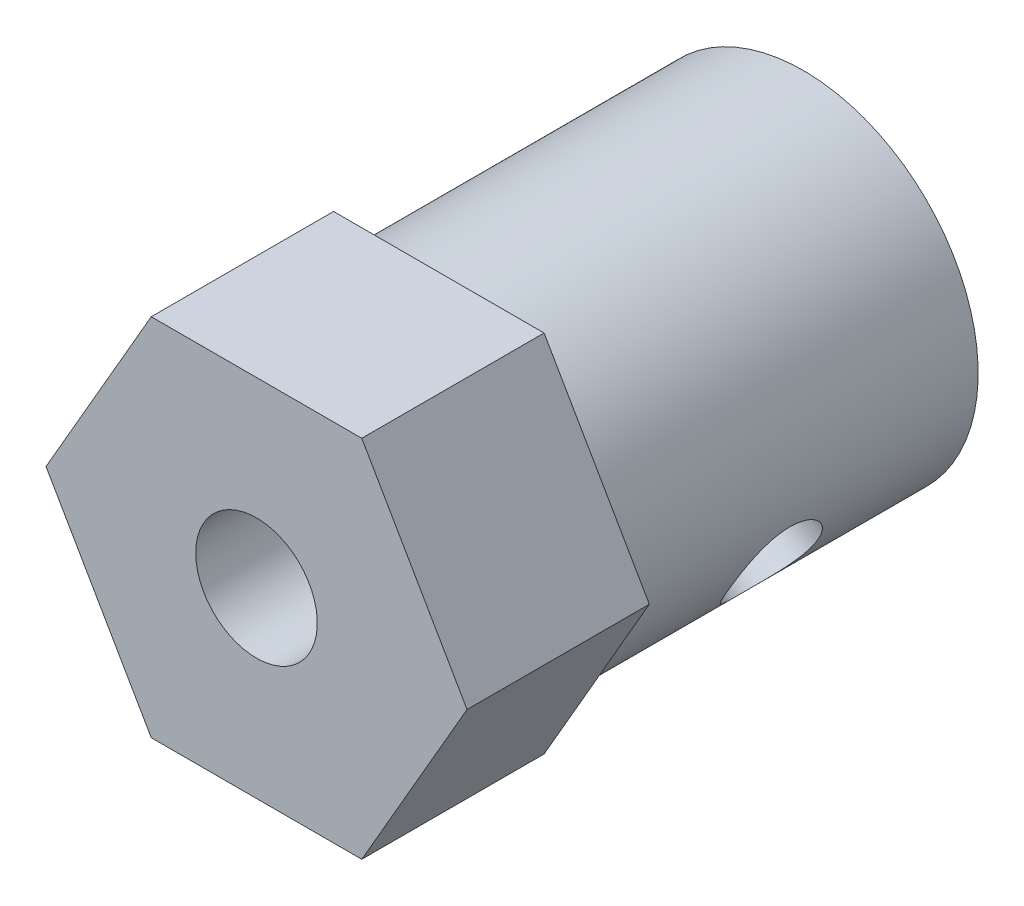
ISO-10303-21;
HEADER;
FILE_DESCRIPTION(('STEP AP214'),'2;1');
FILE_NAME('part.step','',(''),(''),'','','');
FILE_SCHEMA(('AUTOMOTIVE_DESIGN { 1 0 10303 214 1 1 1 1 }'));
ENDSEC;
DATA;
#1=APPLICATION_CONTEXT('core data for automotive mechanical design processes');
#2=APPLICATION_PROTOCOL_DEFINITION('international standard','automotive_design',2000,#1);
#3=PRODUCT_CONTEXT('',#1,'mechanical');
#4=PRODUCT('Part','Part','',(#3));
#5=PRODUCT_RELATED_PRODUCT_CATEGORY('part','',(#4));
#6=PRODUCT_DEFINITION_FORMATION('','',#4);
#7=PRODUCT_DEFINITION_CONTEXT('part definition',#1,'design');
#8=PRODUCT_DEFINITION('design','',#6,#7);
#9=PRODUCT_DEFINITION_SHAPE('','',#8);
#10=(LENGTH_UNIT() NAMED_UNIT(*) SI_UNIT(.MILLI.,.METRE.));
#11=(NAMED_UNIT(*) PLANE_ANGLE_UNIT() SI_UNIT($,.RADIAN.));
#12=(NAMED_UNIT(*) SI_UNIT($,.STERADIAN.) SOLID_ANGLE_UNIT());
#13=UNCERTAINTY_MEASURE_WITH_UNIT(LENGTH_MEASURE(1.E-05),#10,'distance_accuracy_value','');
#14=(GEOMETRIC_REPRESENTATION_CONTEXT(3) GLOBAL_UNCERTAINTY_ASSIGNED_CONTEXT((#13)) GLOBAL_UNIT_ASSIGNED_CONTEXT((#10,
#11,#12)) REPRESENTATION_CONTEXT('',''));
#15=CARTESIAN_POINT('',(0.,0.,0.));
#16=DIRECTION('',(0.,0.,1.));
#17=DIRECTION('',(1.,0.,0.));
#18=AXIS2_PLACEMENT_3D('',#15,#16,#17);
#19=CARTESIAN_POINT('',(-3.46410161513783,5.99999999999996,6.));
#20=DIRECTION('',(0.866025403784441,-0.499999999999995,0.));
#21=DIRECTION('',(0.499999999999995,0.866025403784442,0.));
#22=AXIS2_PLACEMENT_3D('',#19,#20,#21);
#23=PLANE('',#22);
#24=DIRECTION('',(-0.499999999999995,-0.866025403784441,0.));
#25=VECTOR('',#24,1.);
#26=CARTESIAN_POINT('',(-3.46410161513783,5.99999999999996,0.));
#27=LINE('',#26,#25);
#28=CARTESIAN_POINT('',(-3.46410161513783,5.99999999999996,0.));
#29=VERTEX_POINT('',#28);
#30=CARTESIAN_POINT('',(-6.92820323027551,0.,0.));
#31=VERTEX_POINT('',#30);
#32=EDGE_CURVE('E130',#29,#31,#27,.T.);
#33=ORIENTED_EDGE('',*,*,#32,.T.);
#34=DIRECTION('',(0.,0.,-1.));
#35=VECTOR('',#34,1.);
#36=CARTESIAN_POINT('',(-6.92820323027551,0.,6.));
#37=LINE('',#36,#35);
#38=CARTESIAN_POINT('',(-6.92820323027551,0.,6.));
#39=VERTEX_POINT('',#38);
#40=EDGE_CURVE('E52',#39,#31,#37,.T.);
#41=ORIENTED_EDGE('',*,*,#40,.F.);
#42=DIRECTION('',(-0.499999999999995,-0.866025403784441,0.));
#43=VECTOR('',#42,1.);
#44=CARTESIAN_POINT('',(-3.46410161513783,5.99999999999996,6.));
#45=LINE('',#44,#43);
#46=CARTESIAN_POINT('',(-3.46410161513783,5.99999999999996,6.));
#47=VERTEX_POINT('',#46);
#48=EDGE_CURVE('E141',#47,#39,#45,.T.);
#49=ORIENTED_EDGE('',*,*,#48,.F.);
#50=DIRECTION('',(0.,0.,-1.));
#51=VECTOR('',#50,1.);
#52=CARTESIAN_POINT('',(-3.46410161513783,5.99999999999996,6.));
#53=LINE('',#52,#51);
#54=EDGE_CURVE('E126',#47,#29,#53,.T.);
#55=ORIENTED_EDGE('',*,*,#54,.T.);
#56=EDGE_LOOP('',(#33,#41,#49,#55));
#57=FACE_BOUND('',#56,.T.);
#58=ADVANCED_FACE('F38',(#57),#23,.F.);
#59=CARTESIAN_POINT('',(-6.92820323027551,0.,6.));
#60=DIRECTION('',(0.866025403784438,0.500000000000001,0.));
#61=DIRECTION('',(-0.500000000000001,0.866025403784438,0.));
#62=AXIS2_PLACEMENT_3D('',#59,#60,#61);
#63=PLANE('',#62);
#64=DIRECTION('',(0.500000000000001,-0.866025403784438,0.));
#65=VECTOR('',#64,1.);
#66=CARTESIAN_POINT('',(-6.92820323027551,0.,0.));
#67=LINE('',#66,#65);
#68=CARTESIAN_POINT('',(-3.46410161513774,-6.00000000000001,0.));
#69=VERTEX_POINT('',#68);
#70=EDGE_CURVE('E133',#31,#69,#67,.T.);
#71=ORIENTED_EDGE('',*,*,#70,.T.);
#72=DIRECTION('',(0.,0.,-1.));
#73=VECTOR('',#72,1.);
#74=CARTESIAN_POINT('',(-3.46410161513774,-6.00000000000001,6.));
#75=LINE('',#74,#73);
#76=CARTESIAN_POINT('',(-3.46410161513774,-6.00000000000001,6.));
#77=VERTEX_POINT('',#76);
#78=EDGE_CURVE('E145',#77,#69,#75,.T.);
#79=ORIENTED_EDGE('',*,*,#78,.F.);
#80=DIRECTION('',(0.500000000000001,-0.866025403784438,0.));
#81=VECTOR('',#80,1.);
#82=CARTESIAN_POINT('',(-6.92820323027551,0.,6.));
#83=LINE('',#82,#81);
#84=EDGE_CURVE('E99',#39,#77,#83,.T.);
#85=ORIENTED_EDGE('',*,*,#84,.F.);
#86=ORIENTED_EDGE('',*,*,#40,.T.);
#87=EDGE_LOOP('',(#71,#79,#85,#86));
#88=FACE_BOUND('',#87,.T.);
#89=ADVANCED_FACE('F148',(#88),#63,.F.);
#90=CARTESIAN_POINT('',(-3.46410161513774,-6.00000000000001,6.));
#91=DIRECTION('',(0.,1.,0.));
#92=DIRECTION('',(-1.,0.,0.));
#93=AXIS2_PLACEMENT_3D('',#90,#91,#92);
#94=PLANE('',#93);
#95=DIRECTION('',(1.,0.,0.));
#96=VECTOR('',#95,1.);
#97=CARTESIAN_POINT('',(-3.46410161513774,-6.00000000000001,0.));
#98=LINE('',#97,#96);
#99=CARTESIAN_POINT('',(3.46410161513778,-5.99999999999999,0.));
#100=VERTEX_POINT('',#99);
#101=EDGE_CURVE('E136',#69,#100,#98,.T.);
#102=ORIENTED_EDGE('',*,*,#101,.T.);
#103=DIRECTION('',(0.,0.,-1.));
#104=VECTOR('',#103,1.);
#105=CARTESIAN_POINT('',(3.46410161513778,-5.99999999999999,6.));
#106=LINE('',#105,#104);
#107=CARTESIAN_POINT('',(3.46410161513778,-5.99999999999999,6.));
#108=VERTEX_POINT('',#107);
#109=EDGE_CURVE('E121',#108,#100,#106,.T.);
#110=ORIENTED_EDGE('',*,*,#109,.F.);
#111=DIRECTION('',(1.,0.,0.));
#112=VECTOR('',#111,1.);
#113=CARTESIAN_POINT('',(-3.46410161513774,-6.00000000000001,6.));
#114=LINE('',#113,#112);
#115=EDGE_CURVE('E112',#77,#108,#114,.T.);
#116=ORIENTED_EDGE('',*,*,#115,.F.);
#117=ORIENTED_EDGE('',*,*,#78,.T.);
#118=EDGE_LOOP('',(#102,#110,#116,#117));
#119=FACE_BOUND('',#118,.T.);
#120=ADVANCED_FACE('F156',(#119),#94,.F.);
#121=CARTESIAN_POINT('',(3.46410161513778,-5.99999999999999,6.));
#122=DIRECTION('',(-0.866025403784442,0.499999999999995,0.));
#123=DIRECTION('',(-0.499999999999995,-0.866025403784442,0.));
#124=AXIS2_PLACEMENT_3D('',#121,#122,#123);
#125=PLANE('',#124);
#126=DIRECTION('',(0.499999999999995,0.866025403784441,0.));
#127=VECTOR('',#126,1.);
#128=CARTESIAN_POINT('',(3.46410161513778,-5.99999999999999,0.));
#129=LINE('',#128,#127);
#130=CARTESIAN_POINT('',(6.92820323027551,0.,0.));
#131=VERTEX_POINT('',#130);
#132=EDGE_CURVE('E120',#100,#131,#129,.T.);
#133=ORIENTED_EDGE('',*,*,#132,.T.);
#134=DIRECTION('',(0.,0.,-1.));
#135=VECTOR('',#134,1.);
#136=CARTESIAN_POINT('',(6.92820323027551,0.,6.));
#137=LINE('',#136,#135);
#138=CARTESIAN_POINT('',(6.92820323027551,0.,6.));
#139=VERTEX_POINT('',#138);
#140=EDGE_CURVE('E117',#139,#131,#137,.T.);
#141=ORIENTED_EDGE('',*,*,#140,.F.);
#142=DIRECTION('',(0.499999999999995,0.866025403784441,0.));
#143=VECTOR('',#142,1.);
#144=CARTESIAN_POINT('',(3.46410161513778,-5.99999999999999,6.));
#145=LINE('',#144,#143);
#146=EDGE_CURVE('E106',#108,#139,#145,.T.);
#147=ORIENTED_EDGE('',*,*,#146,.F.);
#148=ORIENTED_EDGE('',*,*,#109,.T.);
#149=EDGE_LOOP('',(#133,#141,#147,#148));
#150=FACE_BOUND('',#149,.T.);
#151=ADVANCED_FACE('F118',(#150),#125,.F.);
#152=CARTESIAN_POINT('',(6.92820323027551,0.,6.));
#153=DIRECTION('',(-0.866025403784434,-0.500000000000007,0.));
#154=DIRECTION('',(0.500000000000007,-0.866025403784435,0.));
#155=AXIS2_PLACEMENT_3D('',#152,#153,#154);
#156=PLANE('',#155);
#157=DIRECTION('',(-0.500000000000007,0.866025403784434,0.));
#158=VECTOR('',#157,1.);
#159=CARTESIAN_POINT('',(6.92820323027551,0.,0.));
#160=LINE('',#159,#158);
#161=CARTESIAN_POINT('',(3.4641016151377,6.00000000000003,0.));
#162=VERTEX_POINT('',#161);
#163=EDGE_CURVE('E84',#131,#162,#160,.T.);
#164=ORIENTED_EDGE('',*,*,#163,.T.);
#165=DIRECTION('',(0.,0.,-1.));
#166=VECTOR('',#165,1.);
#167=CARTESIAN_POINT('',(3.4641016151377,6.00000000000003,6.));
#168=LINE('',#167,#166);
#169=CARTESIAN_POINT('',(3.4641016151377,6.00000000000003,6.));
#170=VERTEX_POINT('',#169);
#171=EDGE_CURVE('E122',#170,#162,#168,.T.);
#172=ORIENTED_EDGE('',*,*,#171,.F.);
#173=DIRECTION('',(-0.500000000000007,0.866025403784434,0.));
#174=VECTOR('',#173,1.);
#175=CARTESIAN_POINT('',(6.92820323027551,0.,6.));
#176=LINE('',#175,#174);
#177=EDGE_CURVE('E110',#139,#170,#176,.T.);
#178=ORIENTED_EDGE('',*,*,#177,.F.);
#179=ORIENTED_EDGE('',*,*,#140,.T.);
#180=EDGE_LOOP('',(#164,#172,#178,#179));
#181=FACE_BOUND('',#180,.T.);
#182=ADVANCED_FACE('F124',(#181),#156,.F.);
#183=CARTESIAN_POINT('',(3.4641016151377,6.00000000000003,6.));
#184=DIRECTION('',(0.,-1.,0.));
#185=DIRECTION('',(1.,0.,0.));
#186=AXIS2_PLACEMENT_3D('',#183,#184,#185);
#187=PLANE('',#186);
#188=DIRECTION('',(-1.,0.,0.));
#189=VECTOR('',#188,1.);
#190=CARTESIAN_POINT('',(3.4641016151377,6.00000000000003,0.));
#191=LINE('',#190,#189);
#192=EDGE_CURVE('E90',#162,#29,#191,.T.);
#193=ORIENTED_EDGE('',*,*,#192,.T.);
#194=ORIENTED_EDGE('',*,*,#54,.F.);
#195=DIRECTION('',(-1.,0.,0.));
#196=VECTOR('',#195,1.);
#197=CARTESIAN_POINT('',(3.4641016151377,6.00000000000003,6.));
#198=LINE('',#197,#196);
#199=EDGE_CURVE('E61',#170,#47,#198,.T.);
#200=ORIENTED_EDGE('',*,*,#199,.F.);
#201=ORIENTED_EDGE('',*,*,#171,.T.);
#202=EDGE_LOOP('',(#193,#194,#200,#201));
#203=FACE_BOUND('',#202,.T.);
#204=ADVANCED_FACE('F210',(#203),#187,.F.);
#205=CARTESIAN_POINT('',(0.,0.,6.));
#206=DIRECTION('',(0.,0.,1.));
#207=DIRECTION('',(1.,0.,0.));
#208=AXIS2_PLACEMENT_3D('',#205,#206,#207);
#209=PLANE('',#208);
#210=CARTESIAN_POINT('',(0.,0.,6.));
#211=DIRECTION('',(0.,0.,-1.));
#212=DIRECTION('',(-1.,0.,0.));
#213=AXIS2_PLACEMENT_3D('',#210,#211,#212);
#214=CIRCLE('',#213,2.);
#215=CARTESIAN_POINT('',(-2.,0.,6.));
#216=VERTEX_POINT('',#215);
#217=EDGE_CURVE('E162',#216,#216,#214,.T.);
#218=ORIENTED_EDGE('',*,*,#217,.T.);
#219=EDGE_LOOP('',(#218));
#220=FACE_BOUND('',#219,.T.);
#221=ORIENTED_EDGE('',*,*,#48,.T.);
#222=ORIENTED_EDGE('',*,*,#84,.T.);
#223=ORIENTED_EDGE('',*,*,#115,.T.);
#224=ORIENTED_EDGE('',*,*,#146,.T.);
#225=ORIENTED_EDGE('',*,*,#177,.T.);
#226=ORIENTED_EDGE('',*,*,#199,.T.);
#227=EDGE_LOOP('',(#221,#222,#223,#224,#225,#226));
#228=FACE_BOUND('',#227,.T.);
#229=ADVANCED_FACE('F108',(#220,#228),#209,.T.);
#230=CARTESIAN_POINT('',(0.,0.,0.));
#231=DIRECTION('',(0.,0.,1.));
#232=DIRECTION('',(1.,0.,0.));
#233=AXIS2_PLACEMENT_3D('',#230,#231,#232);
#234=PLANE('',#233);
#235=CARTESIAN_POINT('',(0.,0.,0.));
#236=DIRECTION('',(0.,0.,-1.));
#237=DIRECTION('',(-1.,0.,0.));
#238=AXIS2_PLACEMENT_3D('',#235,#236,#237);
#239=CIRCLE('',#238,5.75);
#240=CARTESIAN_POINT('',(-5.75,0.,0.));
#241=VERTEX_POINT('',#240);
#242=EDGE_CURVE('E11',#241,#241,#239,.T.);
#243=ORIENTED_EDGE('',*,*,#242,.F.);
#244=EDGE_LOOP('',(#243));
#245=FACE_BOUND('',#244,.T.);
#246=ORIENTED_EDGE('',*,*,#32,.F.);
#247=ORIENTED_EDGE('',*,*,#192,.F.);
#248=ORIENTED_EDGE('',*,*,#163,.F.);
#249=ORIENTED_EDGE('',*,*,#132,.F.);
#250=ORIENTED_EDGE('',*,*,#101,.F.);
#251=ORIENTED_EDGE('',*,*,#70,.F.);
#252=EDGE_LOOP('',(#246,#247,#248,#249,#250,#251));
#253=FACE_BOUND('',#252,.T.);
#254=ADVANCED_FACE('F153',(#245,#253),#234,.F.);
#255=CARTESIAN_POINT('',(0.,0.,-12.));
#256=DIRECTION('',(0.,0.,1.));
#257=DIRECTION('',(1.,0.,0.));
#258=AXIS2_PLACEMENT_3D('',#255,#256,#257);
#259=CYLINDRICAL_SURFACE('',#258,5.75);
#260=CARTESIAN_POINT('',(5.55722113075736,-1.47641230822012,-6.));
#261=CARTESIAN_POINT('',(5.55722136071016,-1.47641489598219,-6.08270251187962));
#262=CARTESIAN_POINT('',(5.55540776706454,-1.48329007948835,-6.16542787728107));
#263=CARTESIAN_POINT('',(5.54807553473378,-1.51047987820257,-6.32849428591396));
#264=CARTESIAN_POINT('',(5.54255493246361,-1.53080161590377,-6.40883404193632));
#265=CARTESIAN_POINT('',(5.52760134616089,-1.58394395701895,-6.56474682353535));
#266=CARTESIAN_POINT('',(5.51817370147193,-1.61674749787789,-6.64032619287306));
#267=CARTESIAN_POINT('',(5.49509515344553,-1.69352577324472,-6.78486591425887));
#268=CARTESIAN_POINT('',(5.48144397417512,-1.73750123760575,-6.85382583345769));
#269=CARTESIAN_POINT('',(5.44922524142547,-1.83607840051586,-6.98482034003843));
#270=CARTESIAN_POINT('',(5.43055778730774,-1.89088926191198,-7.04667299219177));
#271=CARTESIAN_POINT('',(5.38812936910052,-2.0085989367878,-7.16009082769641));
#272=CARTESIAN_POINT('',(5.36436789625488,-2.07149855786688,-7.21165498250828));
#273=CARTESIAN_POINT('',(5.31117832236998,-2.20433046836102,-7.30378569751234));
#274=CARTESIAN_POINT('',(5.28166917074583,-2.27435554396496,-7.34417214404675));
#275=CARTESIAN_POINT('',(5.21734054730939,-2.41827644085031,-7.41162763674079));
#276=CARTESIAN_POINT('',(5.18252193222295,-2.49217163639514,-7.43869882845441));
#277=CARTESIAN_POINT('',(5.10890534133279,-2.63974107934647,-7.47816869107317));
#278=CARTESIAN_POINT('',(5.07021160293842,-2.71338451067179,-7.49087666170707));
#279=CARTESIAN_POINT('',(4.98914035484316,-2.8597150031523,-7.50223166870554));
#280=CARTESIAN_POINT('',(4.94676343726796,-2.93240221587847,-7.5008809610801));
#281=CARTESIAN_POINT('',(4.86067756766856,-3.07293746674693,-7.48437641147546));
#282=CARTESIAN_POINT('',(4.81702548141221,-3.14085997104418,-7.46955662892109));
#283=CARTESIAN_POINT('',(4.72892558823583,-3.27200352174088,-7.42707332679328));
#284=CARTESIAN_POINT('',(4.68447773708927,-3.33522430581835,-7.3994090912151));
#285=CARTESIAN_POINT('',(4.59600500303769,-3.45614085391043,-7.33176111055377));
#286=CARTESIAN_POINT('',(4.55198830983483,-3.51377757775231,-7.29166134420953));
#287=CARTESIAN_POINT('',(4.46656720195115,-3.62174318001789,-7.20036926072058));
#288=CARTESIAN_POINT('',(4.42516327919811,-3.67207068458241,-7.14917486269623));
#289=CARTESIAN_POINT('',(4.34556760565659,-3.7659588427232,-7.03536714625521));
#290=CARTESIAN_POINT('',(4.30750615214473,-3.80927692660276,-6.97246225547536));
#291=CARTESIAN_POINT('',(4.23785578042895,-3.8866173972475,-6.83794521486358));
#292=CARTESIAN_POINT('',(4.20626722266665,-3.92063926639042,-6.7663325804967));
#293=CARTESIAN_POINT('',(4.1510923893375,-3.97901518520282,-6.61585635776758));
#294=CARTESIAN_POINT('',(4.12755259364876,-4.00331321465999,-6.53695388838251));
#295=CARTESIAN_POINT('',(4.090138880542,-4.04153276606443,-6.37448448296469));
#296=CARTESIAN_POINT('',(4.0762626840089,-4.05545673474001,-6.29091865178946));
#297=CARTESIAN_POINT('',(4.05931325975991,-4.07242147034947,-6.12406094525848));
#298=CARTESIAN_POINT('',(4.05594186189961,-4.07576266731435,-6.04082983858711));
#299=CARTESIAN_POINT('',(4.05937152111611,-4.07234685151389,-5.87479170466801));
#300=CARTESIAN_POINT('',(4.06617154812631,-4.06559086129712,-5.79198463532986));
#301=CARTESIAN_POINT('',(4.08929757745671,-4.04232648260581,-5.63070165598545));
#302=CARTESIAN_POINT('',(4.10544809988444,-4.02599767699227,-5.5521743674906));
#303=CARTESIAN_POINT('',(4.14620349249304,-3.98401143692444,-5.39995982905624));
#304=CARTESIAN_POINT('',(4.1708094311122,-3.95835282351865,-5.32627319219064));
#305=CARTESIAN_POINT('',(4.22777189799079,-3.89746235669492,-5.18411163032052));
#306=CARTESIAN_POINT('',(4.2602813513885,-3.86203949812469,-5.11577990334861));
#307=CARTESIAN_POINT('',(4.33113840027661,-3.78240336253314,-4.98781144742332));
#308=CARTESIAN_POINT('',(4.36948704402819,-3.73818850672095,-4.92817628346225));
#309=CARTESIAN_POINT('',(4.45138754174426,-3.64030552024393,-4.81760944837593));
#310=CARTESIAN_POINT('',(4.49505352262524,-3.58641077168379,-4.7669623765694));
#311=CARTESIAN_POINT('',(4.58474574264705,-3.47101406352671,-4.67788871513074));
#312=CARTESIAN_POINT('',(4.63077185645956,-3.40951250762377,-4.63946147737699));
#313=CARTESIAN_POINT('',(4.72289476696002,-3.28069833721807,-4.57626499124511));
#314=CARTESIAN_POINT('',(4.76898840829988,-3.21343308512531,-4.55139484814367));
#315=CARTESIAN_POINT('',(4.85978523879196,-3.07438991312508,-4.51572190582261));
#316=CARTESIAN_POINT('',(4.90448871991868,-3.00261295050912,-4.50491613292621));
#317=CARTESIAN_POINT('',(4.98966950541399,-2.85875540689107,-4.49785826561112));
#318=CARTESIAN_POINT('',(5.0302323975609,-2.78674573137666,-4.50118782399509));
#319=CARTESIAN_POINT('',(5.10746567709305,-2.64253393975375,-4.52133940731707));
#320=CARTESIAN_POINT('',(5.14413619951267,-2.57033183041033,-4.53816096401629));
#321=CARTESIAN_POINT('',(5.21263698300613,-2.42839294863188,-4.58458667775333));
#322=CARTESIAN_POINT('',(5.24449642665122,-2.35864345904262,-4.61410920811083));
#323=CARTESIAN_POINT('',(5.30331713657454,-2.22323705430391,-4.68502564003475));
#324=CARTESIAN_POINT('',(5.33027773862,-2.15758069493265,-4.72642114949646));
#325=CARTESIAN_POINT('',(5.37989987925112,-2.03074816512123,-4.8211511060026));
#326=CARTESIAN_POINT('',(5.40243300755437,-1.96973066277838,-4.87476524455818));
#327=CARTESIAN_POINT('',(5.44252151759536,-1.85609752882473,-4.99187563894747));
#328=CARTESIAN_POINT('',(5.46007560580036,-1.80348408209869,-5.05537445615319));
#329=CARTESIAN_POINT('',(5.49085193822908,-1.70752535479361,-5.19204025952238));
#330=CARTESIAN_POINT('',(5.50397654142989,-1.66439548816294,-5.26538079382189));
#331=CARTESIAN_POINT('',(5.525759730213,-1.59058804468881,-5.41866048784024));
#332=CARTESIAN_POINT('',(5.53442135588035,-1.55990199442577,-5.4985951126335));
#333=CARTESIAN_POINT('',(5.54647206684565,-1.51643034957237,-5.64857628641251));
#334=CARTESIAN_POINT('',(5.55051320500374,-1.50146914084626,-5.71794782542872));
#335=CARTESIAN_POINT('',(5.55588749873707,-1.48145952205819,-5.85820741497359));
#336=CARTESIAN_POINT('',(5.55722093360818,-1.47641008961192,-5.92909530833006));
#337=CARTESIAN_POINT('',(5.55722113075736,-1.47641230822012,-6.));
#338=B_SPLINE_CURVE_WITH_KNOTS('',3,(#260,#261,#262,#263,#264,#265,#266,#267,#268,#269,#270,
#271,#272,#273,#274,#275,#276,#277,#278,#279,#280,#281,#282,#283,#284,#285,#286,#287,#288,#289,
#290,#291,#292,#293,#294,#295,#296,#297,#298,#299,#300,#301,#302,#303,#304,#305,#306,#307,#308,
#309,#310,#311,#312,#313,#314,#315,#316,#317,#318,#319,#320,#321,#322,#323,#324,#325,#326,#327,
#328,#329,#330,#331,#332,#333,#334,#335,#336,#337),.UNSPECIFIED.,.T.,.F.,(4,2,2,2,2,2,2,2,2,2,2,
2,2,2,2,2,2,2,2,2,2,2,2,2,2,2,2,2,2,2,2,2,2,2,2,2,2,2,4),(0.,0.247846932213468,
0.495825251450721,0.743465796519596,0.991122523916576,1.24413298994995,1.49716873674027,
1.75407149955015,2.01093285275295,2.26215074877579,2.51332833223609,2.75844131790607,
3.00356796886319,3.25105414713942,3.49858678350027,3.75340001453818,4.00822743093465,
4.26450250455337,4.52071711639577,4.76958977198248,5.01843722578485,5.26275935549397,
5.50711236945145,5.75663370302619,6.00619988401493,6.26263234557327,6.51905120407021,
6.7735347403164,7.02796446151302,7.27491743805458,7.52186184448271,7.76724235555625,
8.01265611292845,8.26438206043911,8.51617334546956,8.77319910700255,9.03004955584013,
9.24256212496341,9.4550527725935),.UNSPECIFIED.);
#339=CARTESIAN_POINT('',(5.55722113075736,-1.47641230822012,-6.));
#340=VERTEX_POINT('',#339);
#341=EDGE_CURVE('E166',#340,#340,#338,.T.);
#342=ORIENTED_EDGE('',*,*,#341,.T.);
#343=EDGE_LOOP('',(#342));
#344=FACE_BOUND('',#343,.T.);
#345=CARTESIAN_POINT('',(0.,0.,-12.));
#346=DIRECTION('',(0.,0.,-1.));
#347=DIRECTION('',(-1.,0.,0.));
#348=AXIS2_PLACEMENT_3D('',#345,#346,#347);
#349=CIRCLE('',#348,5.75);
#350=CARTESIAN_POINT('',(-5.75,0.,-12.));
#351=VERTEX_POINT('',#350);
#352=EDGE_CURVE('E134',#351,#351,#349,.T.);
#353=ORIENTED_EDGE('',*,*,#352,.F.);
#354=EDGE_LOOP('',(#353));
#355=FACE_BOUND('',#354,.T.);
#356=ORIENTED_EDGE('',*,*,#242,.T.);
#357=EDGE_LOOP('',(#356));
#358=FACE_BOUND('',#357,.T.);
#359=ADVANCED_FACE('F174',(#344,#355,#358),#259,.T.);
#360=CARTESIAN_POINT('',(0.,0.,-12.));
#361=DIRECTION('',(0.,0.,-1.));
#362=DIRECTION('',(-1.,0.,0.));
#363=AXIS2_PLACEMENT_3D('',#360,#361,#362);
#364=PLANE('',#363);
#365=CARTESIAN_POINT('',(0.,0.,-12.));
#366=DIRECTION('',(0.,0.,-1.));
#367=DIRECTION('',(-1.,0.,0.));
#368=AXIS2_PLACEMENT_3D('',#365,#366,#367);
#369=CIRCLE('',#368,2.);
#370=CARTESIAN_POINT('',(-2.,0.,-12.));
#371=VERTEX_POINT('',#370);
#372=EDGE_CURVE('E163',#371,#371,#369,.T.);
#373=ORIENTED_EDGE('',*,*,#372,.F.);
#374=EDGE_LOOP('',(#373));
#375=FACE_BOUND('',#374,.T.);
#376=ORIENTED_EDGE('',*,*,#352,.T.);
#377=EDGE_LOOP('',(#376));
#378=FACE_BOUND('',#377,.T.);
#379=ADVANCED_FACE('F186',(#375,#378),#364,.T.);
#380=CARTESIAN_POINT('',(0.,0.,6.));
#381=DIRECTION('',(0.,0.,-1.));
#382=DIRECTION('',(-1.,0.,0.));
#383=AXIS2_PLACEMENT_3D('',#380,#381,#382);
#384=CYLINDRICAL_SURFACE('',#383,2.);
#385=CARTESIAN_POINT('',(1.89564392373896,0.637600277910521,-6.));
#386=CARTESIAN_POINT('',(1.89565408748977,0.637585392226017,-5.93000257657437));
#387=CARTESIAN_POINT('',(1.89809043080659,0.630461731209003,-5.85995416568808));
#388=CARTESIAN_POINT('',(1.90694493610832,0.603112635919791,-5.72267014379052));
#389=CARTESIAN_POINT('',(1.91337496438087,0.582848148864563,-5.65544355498049));
#390=CARTESIAN_POINT('',(1.92810346331423,0.532070602372363,-5.52642015326162));
#391=CARTESIAN_POINT('',(1.9363749313233,0.501702798658393,-5.46456122323754));
#392=CARTESIAN_POINT('',(1.9529234442087,0.432833528036545,-5.34565454555481));
#393=CARTESIAN_POINT('',(1.96120048829051,0.394333044249429,-5.28860621753078));
#394=CARTESIAN_POINT('',(1.97773475424673,0.301990819027158,-5.16788720368341));
#395=CARTESIAN_POINT('',(1.98562473025925,0.246624837378533,-5.10533206577352));
#396=CARTESIAN_POINT('',(1.99678356754875,0.128107308785516,-4.98747453375773));
#397=CARTESIAN_POINT('',(2.000045557029,0.0649443354291057,-4.93218303517973));
#398=CARTESIAN_POINT('',(1.99994409142852,-0.0812468700736291,-4.81914126134453));
#399=CARTESIAN_POINT('',(1.99509185976308,-0.165697957718434,-4.76319403328015));
#400=CARTESIAN_POINT('',(1.97270771920409,-0.340826196887827,-4.66537779171717));
#401=CARTESIAN_POINT('',(1.95520591099417,-0.431488106501225,-4.62347570253119));
#402=CARTESIAN_POINT('',(1.91298074093011,-0.58730534261325,-4.56679231409706));
#403=CARTESIAN_POINT('',(1.89202742708328,-0.651906585398064,-4.54764290402153));
#404=CARTESIAN_POINT('',(1.84275156522514,-0.780373382054083,-4.51860988400325));
#405=CARTESIAN_POINT('',(1.81443544704665,-0.844239527308522,-4.50871822389326));
#406=CARTESIAN_POINT('',(1.75077468959898,-0.969396796570666,-4.49877826613751));
#407=CARTESIAN_POINT('',(1.71541202495333,-1.03068081801613,-4.49875554562356));
#408=CARTESIAN_POINT('',(1.63879999349243,-1.14859927788889,-4.50861793678029));
#409=CARTESIAN_POINT('',(1.59754926533105,-1.20523263627904,-4.51850534290815));
#410=CARTESIAN_POINT('',(1.51222065234838,-1.31058455676589,-4.54708105058987));
#411=CARTESIAN_POINT('',(1.4682879852632,-1.35950776469479,-4.56545632638708));
#412=CARTESIAN_POINT('',(1.37790903600702,-1.45103711456793,-4.60999564218224));
#413=CARTESIAN_POINT('',(1.33146220755323,-1.49364187604387,-4.63616138051316));
#414=CARTESIAN_POINT('',(1.23239733682158,-1.57664611720255,-4.69852961514532));
#415=CARTESIAN_POINT('',(1.17965563227528,-1.61630732162638,-4.73551209661876));
#416=CARTESIAN_POINT('',(1.07457113996937,-1.68800223890063,-4.81673370397051));
#417=CARTESIAN_POINT('',(1.02222873227807,-1.72002939434675,-4.8609790136999));
#418=CARTESIAN_POINT('',(0.90946164240837,-1.78264154526087,-4.96522334882094));
#419=CARTESIAN_POINT('',(0.849472575511646,-1.81170345690481,-5.0266092100264));
#420=CARTESIAN_POINT('',(0.735282235280918,-1.86097297626604,-5.15783458362194));
#421=CARTESIAN_POINT('',(0.681083725991975,-1.88117636964407,-5.22767809952506));
#422=CARTESIAN_POINT('',(0.592127494785223,-1.91079361445672,-5.36098187024563));
#423=CARTESIAN_POINT('',(0.555643511488165,-1.92154920300619,-5.42298704530065));
#424=CARTESIAN_POINT('',(0.491826641358086,-1.93886609379974,-5.55206528141938));
#425=CARTESIAN_POINT('',(0.464473103722224,-1.94543689201414,-5.61912647969037));
#426=CARTESIAN_POINT('',(0.426505115286103,-1.95407248304111,-5.74368694399832));
#427=CARTESIAN_POINT('',(0.413647540168986,-1.95677223513885,-5.80044708211686));
#428=CARTESIAN_POINT('',(0.397567036428446,-1.96010546225804,-5.91535546617382));
#429=CARTESIAN_POINT('',(0.394331781273287,-1.96074158096169,-5.97350183990282));
#430=CARTESIAN_POINT('',(0.397935743729608,-1.96001244952257,-6.0894789917334));
#431=CARTESIAN_POINT('',(0.404778669514207,-1.95864646272456,-6.14730964580967));
#432=CARTESIAN_POINT('',(0.427607342520076,-1.95378673256666,-6.26107615244287));
#433=CARTESIAN_POINT('',(0.443608694536481,-1.95028935693044,-6.3170085979481));
#434=CARTESIAN_POINT('',(0.490410008887606,-1.93914011382242,-6.44633804493887));
#435=CARTESIAN_POINT('',(0.524507283729587,-1.93042320958673,-6.51843595391503));
#436=CARTESIAN_POINT('',(0.602270967960618,-1.90759330516805,-6.65630766364012));
#437=CARTESIAN_POINT('',(0.64595496460942,-1.89347035143974,-6.72206951729475));
#438=CARTESIAN_POINT('',(0.741248766239048,-1.85828512333923,-6.84934900804812));
#439=CARTESIAN_POINT('',(0.793085005232826,-1.83699415313664,-6.91063287621826));
#440=CARTESIAN_POINT('',(0.900859102345453,-1.78661638972402,-7.02600209636125));
#441=CARTESIAN_POINT('',(0.956798945733181,-1.75752580485511,-7.08008392798894));
#442=CARTESIAN_POINT('',(1.08306347963633,-1.68328347791819,-7.19127699162937));
#443=CARTESIAN_POINT('',(1.1538640186322,-1.63601237801057,-7.2464752388576));
#444=CARTESIAN_POINT('',(1.29427595520157,-1.52731038197266,-7.34262073345087));
#445=CARTESIAN_POINT('',(1.36388961107558,-1.46591061874742,-7.38359882458129));
#446=CARTESIAN_POINT('',(1.47700387262091,-1.35014237769218,-7.43843799144687));
#447=CARTESIAN_POINT('',(1.52200059949122,-1.29932719312372,-7.45675679327544));
#448=CARTESIAN_POINT('',(1.60756517285095,-1.19182075592637,-7.48412879630752));
#449=CARTESIAN_POINT('',(1.64813694997,-1.13513480695956,-7.49319028154851));
#450=CARTESIAN_POINT('',(1.72346052121869,-1.01715014675134,-7.5015163909286));
#451=CARTESIAN_POINT('',(1.75819846011135,-0.955840941675908,-7.50075801734824));
#452=CARTESIAN_POINT('',(1.8207033481814,-0.830625360315247,-7.48943900869876));
#453=CARTESIAN_POINT('',(1.84846843777298,-0.766718296476743,-7.47887576229252));
#454=CARTESIAN_POINT('',(1.89593226272871,-0.640217011748743,-7.44902508383276));
#455=CARTESIAN_POINT('',(1.91584176676155,-0.577638536564037,-7.42999981867845));
#456=CARTESIAN_POINT('',(1.94894647050619,-0.453580103353954,-7.38421193438106));
#457=CARTESIAN_POINT('',(1.96214023231773,-0.392100383298409,-7.35744766016908));
#458=CARTESIAN_POINT('',(1.98357363241055,-0.264702532323767,-7.29372206240403));
#459=CARTESIAN_POINT('',(1.99108276584025,-0.199070541641533,-7.25594906864041));
#460=CARTESIAN_POINT('',(1.9997147986867,-0.0721024895415947,-7.17313355944579));
#461=CARTESIAN_POINT('',(2.00083179391228,-0.0107704514578875,-7.12808436271395));
#462=CARTESIAN_POINT('',(1.99774537198575,0.118069424022804,-7.02199463343921));
#463=CARTESIAN_POINT('',(1.99244573883613,0.184398800894357,-6.95955360056009));
#464=CARTESIAN_POINT('',(1.97721613716281,0.307317157844429,-6.82613192810012));
#465=CARTESIAN_POINT('',(1.96728447604931,0.3639025670211,-6.75514817396343));
#466=CARTESIAN_POINT('',(1.948306507184,0.453573830174073,-6.62111674940969));
#467=CARTESIAN_POINT('',(1.93953208214806,0.489095609037574,-6.55966501729344));
#468=CARTESIAN_POINT('',(1.92308431955569,0.550228455684844,-6.43191708694412));
#469=CARTESIAN_POINT('',(1.91540809509365,0.575865819937025,-6.36563430840455));
#470=CARTESIAN_POINT('',(1.90507025160778,0.609030000107483,-6.24921178040307));
#471=CARTESIAN_POINT('',(1.901598338128,0.619662331912665,-6.20003292870953));
#472=CARTESIAN_POINT('',(1.89688225311123,0.633950530515304,-6.10057766696635));
#473=CARTESIAN_POINT('',(1.89563661979891,0.637610975156952,-6.05030199905627));
#474=CARTESIAN_POINT('',(1.89564392373896,0.637600277910521,-6.));
#475=B_SPLINE_CURVE_WITH_KNOTS('',3,(#385,#386,#387,#388,#389,#390,#391,#392,#393,#394,#395,
#396,#397,#398,#399,#400,#401,#402,#403,#404,#405,#406,#407,#408,#409,#410,#411,#412,#413,#414,
#415,#416,#417,#418,#419,#420,#421,#422,#423,#424,#425,#426,#427,#428,#429,#430,#431,#432,#433,
#434,#435,#436,#437,#438,#439,#440,#441,#442,#443,#444,#445,#446,#447,#448,#449,#450,#451,#452,
#453,#454,#455,#456,#457,#458,#459,#460,#461,#462,#463,#464,#465,#466,#467,#468,#469,#470,#471,
#472,#473,#474),.UNSPECIFIED.,.T.,.F.,(4,2,2,2,2,2,2,2,2,2,2,2,2,2,2,2,2,2,2,2,2,2,2,2,2,2,2,2,
2,2,2,2,2,2,2,2,2,2,2,2,2,2,2,2,4),(0.,0.20973177668449,0.420089722582994,0.627545385620139,
0.834975984672345,1.08585208691169,1.33710031031849,1.63964848103538,1.94147907444963,
2.15227725277555,2.36289195870711,2.57405250727807,2.78526195641288,2.9892375589505,
3.19325766108669,3.41936844116895,3.64567274887663,3.91649517204702,4.18744629647933,
4.40499409477196,4.62204646613006,4.79608005545901,4.96989060538193,5.14376512326213,
5.31793678696019,5.55730028202398,5.79710662639151,6.0454320909006,6.29387849446618,
6.59652499511463,6.89851088586565,7.10852896194427,7.31835893539181,7.52868041101043,
7.73905791773945,7.94332812691912,8.14764205379333,8.3751005248961,8.60276905744644,
8.87547580578155,9.14828228208531,9.36218279640835,9.57551025772699,9.72632812073766,
9.87704692032409),.UNSPECIFIED.);
#476=CARTESIAN_POINT('',(1.89564392373896,0.637600277910521,-6.));
#477=VERTEX_POINT('',#476);
#478=EDGE_CURVE('E41',#477,#477,#475,.T.);
#479=ORIENTED_EDGE('',*,*,#478,.T.);
#480=EDGE_LOOP('',(#479));
#481=FACE_BOUND('',#480,.T.);
#482=ORIENTED_EDGE('',*,*,#217,.F.);
#483=EDGE_LOOP('',(#482));
#484=FACE_BOUND('',#483,.T.);
#485=ORIENTED_EDGE('',*,*,#372,.T.);
#486=EDGE_LOOP('',(#485));
#487=FACE_BOUND('',#486,.T.);
#488=ADVANCED_FACE('F181',(#481,#484,#487),#384,.F.);
#489=CARTESIAN_POINT('',(0.,0.,-6.));
#490=DIRECTION('',(0.866025403784441,-0.499999999999995,0.));
#491=DIRECTION('',(0.499999999999995,0.866025403784441,0.));
#492=AXIS2_PLACEMENT_3D('',#489,#490,#491);
#493=CYLINDRICAL_SURFACE('',#492,1.5);
#494=ORIENTED_EDGE('',*,*,#478,.F.);
#495=EDGE_LOOP('',(#494));
#496=FACE_BOUND('',#495,.T.);
#497=ORIENTED_EDGE('',*,*,#341,.F.);
#498=EDGE_LOOP('',(#497));
#499=FACE_BOUND('',#498,.T.);
#500=ADVANCED_FACE('F178',(#496,#499),#493,.F.);
#501=CLOSED_SHELL('',(#58,#89,#120,#151,#182,#204,#229,#254,#359,#379,#488,#500));
#502=MANIFOLD_SOLID_BREP('B2',#501);
#503=ADVANCED_BREP_SHAPE_REPRESENTATION('',(#18,#502),#14);
#504=SHAPE_DEFINITION_REPRESENTATION(#9,#503);
ENDSEC;
END-ISO-10303-21;
